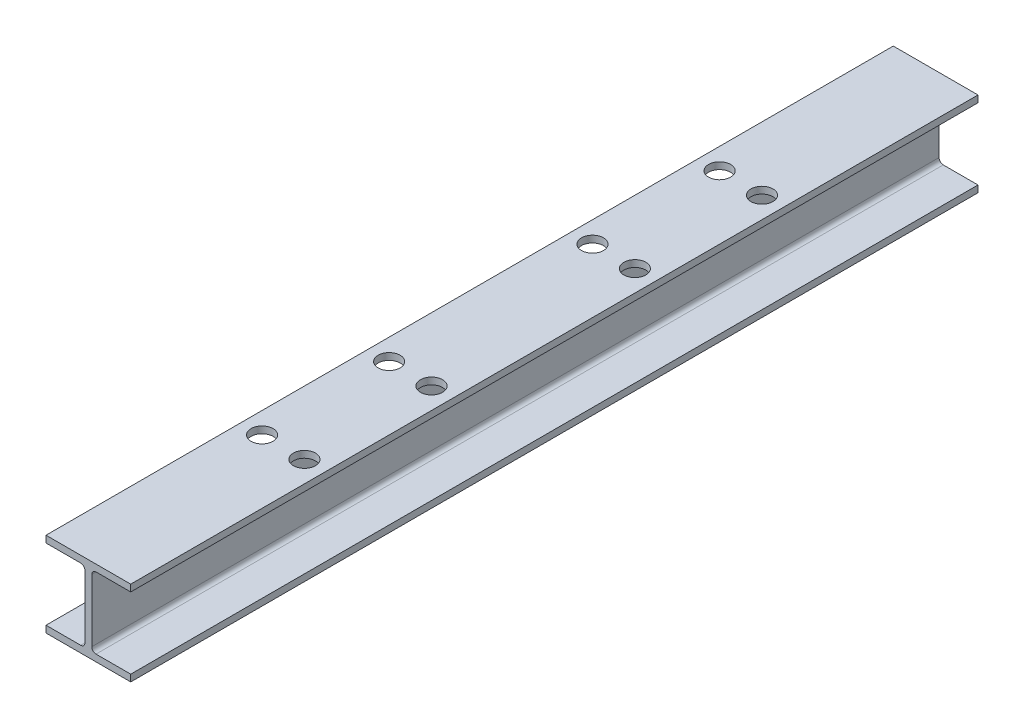
ISO-10303-21;
HEADER;
FILE_DESCRIPTION(('STEP AP214'),'2;1');
FILE_NAME('part.step','',(''),(''),'','','');
FILE_SCHEMA(('AUTOMOTIVE_DESIGN { 1 0 10303 214 1 1 1 1 }'));
ENDSEC;
DATA;
#1=APPLICATION_CONTEXT('core data for automotive mechanical design processes');
#2=APPLICATION_PROTOCOL_DEFINITION('international standard','automotive_design',2000,#1);
#3=PRODUCT_CONTEXT('',#1,'mechanical');
#4=PRODUCT('Part','Part','',(#3));
#5=PRODUCT_RELATED_PRODUCT_CATEGORY('part','',(#4));
#6=PRODUCT_DEFINITION_FORMATION('','',#4);
#7=PRODUCT_DEFINITION_CONTEXT('part definition',#1,'design');
#8=PRODUCT_DEFINITION('design','',#6,#7);
#9=PRODUCT_DEFINITION_SHAPE('','',#8);
#10=(LENGTH_UNIT() NAMED_UNIT(*) SI_UNIT(.MILLI.,.METRE.));
#11=(NAMED_UNIT(*) PLANE_ANGLE_UNIT() SI_UNIT($,.RADIAN.));
#12=(NAMED_UNIT(*) SI_UNIT($,.STERADIAN.) SOLID_ANGLE_UNIT());
#13=UNCERTAINTY_MEASURE_WITH_UNIT(LENGTH_MEASURE(1.E-05),#10,'distance_accuracy_value','');
#14=(GEOMETRIC_REPRESENTATION_CONTEXT(3) GLOBAL_UNCERTAINTY_ASSIGNED_CONTEXT((#13)) GLOBAL_UNIT_ASSIGNED_CONTEXT((#10,
#11,#12)) REPRESENTATION_CONTEXT('',''));
#15=CARTESIAN_POINT('',(0.,0.,0.));
#16=DIRECTION('',(0.,0.,1.));
#17=DIRECTION('',(1.,0.,0.));
#18=AXIS2_PLACEMENT_3D('',#15,#16,#17);
#19=CARTESIAN_POINT('',(25.,40.,380.));
#20=DIRECTION('',(0.,1.,0.));
#21=DIRECTION('',(0.,0.,1.));
#22=AXIS2_PLACEMENT_3D('',#19,#20,#21);
#23=CYLINDRICAL_SURFACE('',#22,13.);
#24=CARTESIAN_POINT('',(25.,50.,380.));
#25=DIRECTION('',(0.,1.,0.));
#26=DIRECTION('',(0.,0.,1.));
#27=AXIS2_PLACEMENT_3D('',#24,#25,#26);
#28=CIRCLE('',#27,13.);
#29=CARTESIAN_POINT('',(25.,50.,393.));
#30=VERTEX_POINT('',#29);
#31=EDGE_CURVE('E286',#30,#30,#28,.T.);
#32=ORIENTED_EDGE('',*,*,#31,.T.);
#33=EDGE_LOOP('',(#32));
#34=FACE_BOUND('',#33,.T.);
#35=CARTESIAN_POINT('',(25.,42.,380.));
#36=DIRECTION('',(0.,1.,0.));
#37=DIRECTION('',(0.,0.,1.));
#38=AXIS2_PLACEMENT_3D('',#35,#36,#37);
#39=CIRCLE('',#38,13.);
#40=CARTESIAN_POINT('',(25.,42.,393.));
#41=VERTEX_POINT('',#40);
#42=EDGE_CURVE('E44',#41,#41,#39,.T.);
#43=ORIENTED_EDGE('',*,*,#42,.F.);
#44=EDGE_LOOP('',(#43));
#45=FACE_BOUND('',#44,.T.);
#46=ADVANCED_FACE('F40',(#34,#45),#23,.F.);
#47=CARTESIAN_POINT('',(25.,40.,620.));
#48=DIRECTION('',(0.,1.,0.));
#49=DIRECTION('',(0.,0.,1.));
#50=AXIS2_PLACEMENT_3D('',#47,#48,#49);
#51=CYLINDRICAL_SURFACE('',#50,13.);
#52=CARTESIAN_POINT('',(25.,50.,620.));
#53=DIRECTION('',(0.,1.,0.));
#54=DIRECTION('',(0.,0.,1.));
#55=AXIS2_PLACEMENT_3D('',#52,#53,#54);
#56=CIRCLE('',#55,13.);
#57=CARTESIAN_POINT('',(25.,50.,633.));
#58=VERTEX_POINT('',#57);
#59=EDGE_CURVE('E288',#58,#58,#56,.T.);
#60=ORIENTED_EDGE('',*,*,#59,.T.);
#61=EDGE_LOOP('',(#60));
#62=FACE_BOUND('',#61,.T.);
#63=CARTESIAN_POINT('',(25.,42.,620.));
#64=DIRECTION('',(0.,1.,0.));
#65=DIRECTION('',(0.,0.,1.));
#66=AXIS2_PLACEMENT_3D('',#63,#64,#65);
#67=CIRCLE('',#66,13.);
#68=CARTESIAN_POINT('',(25.,42.,633.));
#69=VERTEX_POINT('',#68);
#70=EDGE_CURVE('E291',#69,#69,#67,.T.);
#71=ORIENTED_EDGE('',*,*,#70,.F.);
#72=EDGE_LOOP('',(#71));
#73=FACE_BOUND('',#72,.T.);
#74=ADVANCED_FACE('F333',(#62,#73),#51,.F.);
#75=CARTESIAN_POINT('',(25.,40.,230.));
#76=DIRECTION('',(0.,1.,0.));
#77=DIRECTION('',(0.,0.,1.));
#78=AXIS2_PLACEMENT_3D('',#75,#76,#77);
#79=CYLINDRICAL_SURFACE('',#78,13.);
#80=CARTESIAN_POINT('',(25.,50.,230.));
#81=DIRECTION('',(0.,1.,0.));
#82=DIRECTION('',(0.,0.,1.));
#83=AXIS2_PLACEMENT_3D('',#80,#81,#82);
#84=CIRCLE('',#83,13.);
#85=CARTESIAN_POINT('',(25.,50.,243.));
#86=VERTEX_POINT('',#85);
#87=EDGE_CURVE('E294',#86,#86,#84,.T.);
#88=ORIENTED_EDGE('',*,*,#87,.T.);
#89=EDGE_LOOP('',(#88));
#90=FACE_BOUND('',#89,.T.);
#91=CARTESIAN_POINT('',(25.,42.,230.));
#92=DIRECTION('',(0.,1.,0.));
#93=DIRECTION('',(0.,0.,1.));
#94=AXIS2_PLACEMENT_3D('',#91,#92,#93);
#95=CIRCLE('',#94,13.);
#96=CARTESIAN_POINT('',(25.,42.,243.));
#97=VERTEX_POINT('',#96);
#98=EDGE_CURVE('E311',#97,#97,#95,.T.);
#99=ORIENTED_EDGE('',*,*,#98,.F.);
#100=EDGE_LOOP('',(#99));
#101=FACE_BOUND('',#100,.T.);
#102=ADVANCED_FACE('F340',(#90,#101),#79,.F.);
#103=CARTESIAN_POINT('',(25.,40.,770.));
#104=DIRECTION('',(0.,1.,0.));
#105=DIRECTION('',(0.,0.,1.));
#106=AXIS2_PLACEMENT_3D('',#103,#104,#105);
#107=CYLINDRICAL_SURFACE('',#106,13.);
#108=CARTESIAN_POINT('',(25.,50.,770.));
#109=DIRECTION('',(0.,1.,0.));
#110=DIRECTION('',(0.,0.,1.));
#111=AXIS2_PLACEMENT_3D('',#108,#109,#110);
#112=CIRCLE('',#111,13.);
#113=CARTESIAN_POINT('',(25.,50.,783.));
#114=VERTEX_POINT('',#113);
#115=EDGE_CURVE('E297',#114,#114,#112,.T.);
#116=ORIENTED_EDGE('',*,*,#115,.T.);
#117=EDGE_LOOP('',(#116));
#118=FACE_BOUND('',#117,.T.);
#119=CARTESIAN_POINT('',(25.,42.,770.));
#120=DIRECTION('',(0.,1.,0.));
#121=DIRECTION('',(0.,0.,1.));
#122=AXIS2_PLACEMENT_3D('',#119,#120,#121);
#123=CIRCLE('',#122,13.);
#124=CARTESIAN_POINT('',(25.,42.,783.));
#125=VERTEX_POINT('',#124);
#126=EDGE_CURVE('E300',#125,#125,#123,.T.);
#127=ORIENTED_EDGE('',*,*,#126,.F.);
#128=EDGE_LOOP('',(#127));
#129=FACE_BOUND('',#128,.T.);
#130=ADVANCED_FACE('F547',(#118,#129),#107,.F.);
#131=CARTESIAN_POINT('',(50.,42.,1000.));
#132=DIRECTION('',(-1.,0.,0.));
#133=DIRECTION('',(0.,0.,1.));
#134=AXIS2_PLACEMENT_3D('',#131,#132,#133);
#135=PLANE('',#134);
#136=DIRECTION('',(0.,1.,0.));
#137=VECTOR('',#136,1.);
#138=CARTESIAN_POINT('',(50.,42.,0.));
#139=LINE('',#138,#137);
#140=CARTESIAN_POINT('',(50.,42.,0.));
#141=VERTEX_POINT('',#140);
#142=CARTESIAN_POINT('',(50.,50.,0.));
#143=VERTEX_POINT('',#142);
#144=EDGE_CURVE('E308',#141,#143,#139,.T.);
#145=ORIENTED_EDGE('',*,*,#144,.T.);
#146=DIRECTION('',(0.,0.,-1.));
#147=VECTOR('',#146,1.);
#148=CARTESIAN_POINT('',(50.,50.,1000.));
#149=LINE('',#148,#147);
#150=CARTESIAN_POINT('',(50.,50.,1000.));
#151=VERTEX_POINT('',#150);
#152=EDGE_CURVE('E315',#151,#143,#149,.T.);
#153=ORIENTED_EDGE('',*,*,#152,.F.);
#154=DIRECTION('',(0.,1.,0.));
#155=VECTOR('',#154,1.);
#156=CARTESIAN_POINT('',(50.,42.,1000.));
#157=LINE('',#156,#155);
#158=CARTESIAN_POINT('',(50.,42.,1000.));
#159=VERTEX_POINT('',#158);
#160=EDGE_CURVE('E301',#159,#151,#157,.T.);
#161=ORIENTED_EDGE('',*,*,#160,.F.);
#162=DIRECTION('',(0.,0.,-1.));
#163=VECTOR('',#162,1.);
#164=CARTESIAN_POINT('',(50.,42.,1000.));
#165=LINE('',#164,#163);
#166=EDGE_CURVE('E307',#159,#141,#165,.T.);
#167=ORIENTED_EDGE('',*,*,#166,.T.);
#168=EDGE_LOOP('',(#145,#153,#161,#167));
#169=FACE_BOUND('',#168,.T.);
#170=ADVANCED_FACE('F539',(#169),#135,.F.);
#171=CARTESIAN_POINT('',(4.,42.,1000.));
#172=DIRECTION('',(0.,1.,0.));
#173=DIRECTION('',(0.,0.,1.));
#174=AXIS2_PLACEMENT_3D('',#171,#172,#173);
#175=PLANE('',#174);
#176=ORIENTED_EDGE('',*,*,#42,.T.);
#177=EDGE_LOOP('',(#176));
#178=FACE_BOUND('',#177,.T.);
#179=ORIENTED_EDGE('',*,*,#70,.T.);
#180=EDGE_LOOP('',(#179));
#181=FACE_BOUND('',#180,.T.);
#182=ORIENTED_EDGE('',*,*,#98,.T.);
#183=EDGE_LOOP('',(#182));
#184=FACE_BOUND('',#183,.T.);
#185=ORIENTED_EDGE('',*,*,#126,.T.);
#186=EDGE_LOOP('',(#185));
#187=FACE_BOUND('',#186,.T.);
#188=DIRECTION('',(1.,0.,0.));
#189=VECTOR('',#188,1.);
#190=CARTESIAN_POINT('',(4.,42.,1000.));
#191=LINE('',#190,#189);
#192=CARTESIAN_POINT('',(9.,42.,1000.));
#193=VERTEX_POINT('',#192);
#194=EDGE_CURVE('E304',#193,#159,#191,.T.);
#195=ORIENTED_EDGE('',*,*,#194,.F.);
#196=DIRECTION('',(0.,0.,-1.));
#197=VECTOR('',#196,1.);
#198=CARTESIAN_POINT('',(9.,42.,0.));
#199=LINE('',#198,#197);
#200=CARTESIAN_POINT('',(9.,42.,0.));
#201=VERTEX_POINT('',#200);
#202=EDGE_CURVE('E318',#193,#201,#199,.T.);
#203=ORIENTED_EDGE('',*,*,#202,.T.);
#204=DIRECTION('',(1.,0.,0.));
#205=VECTOR('',#204,1.);
#206=CARTESIAN_POINT('',(4.,42.,0.));
#207=LINE('',#206,#205);
#208=EDGE_CURVE('E305',#201,#141,#207,.T.);
#209=ORIENTED_EDGE('',*,*,#208,.T.);
#210=ORIENTED_EDGE('',*,*,#166,.F.);
#211=EDGE_LOOP('',(#195,#203,#209,#210));
#212=FACE_BOUND('',#211,.T.);
#213=ADVANCED_FACE('F330',(#178,#181,#184,#187,#212),#175,.F.);
#214=CARTESIAN_POINT('',(0.,0.,0.));
#215=DIRECTION('',(0.,0.,-1.));
#216=DIRECTION('',(-1.,0.,0.));
#217=AXIS2_PLACEMENT_3D('',#214,#215,#216);
#218=PLANE('',#217);
#219=CARTESIAN_POINT('',(9.,37.,0.));
#220=DIRECTION('',(0.,0.,-1.));
#221=DIRECTION('',(-1.,0.,0.));
#222=AXIS2_PLACEMENT_3D('',#219,#220,#221);
#223=CIRCLE('',#222,5.);
#224=CARTESIAN_POINT('',(4.,37.,0.));
#225=VERTEX_POINT('',#224);
#226=EDGE_CURVE('E49',#201,#225,#223,.F.);
#227=ORIENTED_EDGE('',*,*,#226,.T.);
#228=DIRECTION('',(0.,1.,0.));
#229=VECTOR('',#228,1.);
#230=CARTESIAN_POINT('',(4.00000000000001,-42.,0.));
#231=LINE('',#230,#229);
#232=CARTESIAN_POINT('',(4.00000000000001,-37.,0.));
#233=VERTEX_POINT('',#232);
#234=EDGE_CURVE('E247',#233,#225,#231,.T.);
#235=ORIENTED_EDGE('',*,*,#234,.F.);
#236=CARTESIAN_POINT('',(9.00000000000001,-37.,0.));
#237=DIRECTION('',(0.,0.,-1.));
#238=DIRECTION('',(-1.,0.,0.));
#239=AXIS2_PLACEMENT_3D('',#236,#237,#238);
#240=CIRCLE('',#239,5.);
#241=CARTESIAN_POINT('',(9.00000000000001,-42.,0.));
#242=VERTEX_POINT('',#241);
#243=EDGE_CURVE('E276',#233,#242,#240,.F.);
#244=ORIENTED_EDGE('',*,*,#243,.T.);
#245=DIRECTION('',(-1.,0.,0.));
#246=VECTOR('',#245,1.);
#247=CARTESIAN_POINT('',(4.00000000000001,-42.,0.));
#248=LINE('',#247,#246);
#249=CARTESIAN_POINT('',(50.,-42.,0.));
#250=VERTEX_POINT('',#249);
#251=EDGE_CURVE('E260',#250,#242,#248,.T.);
#252=ORIENTED_EDGE('',*,*,#251,.F.);
#253=DIRECTION('',(0.,1.,0.));
#254=VECTOR('',#253,1.);
#255=CARTESIAN_POINT('',(50.,-50.,0.));
#256=LINE('',#255,#254);
#257=CARTESIAN_POINT('',(50.,-50.,0.));
#258=VERTEX_POINT('',#257);
#259=EDGE_CURVE('E264',#258,#250,#256,.T.);
#260=ORIENTED_EDGE('',*,*,#259,.F.);
#261=DIRECTION('',(1.,0.,0.));
#262=VECTOR('',#261,1.);
#263=CARTESIAN_POINT('',(-50.,-50.,0.));
#264=LINE('',#263,#262);
#265=CARTESIAN_POINT('',(-50.,-50.,0.));
#266=VERTEX_POINT('',#265);
#267=EDGE_CURVE('E256',#266,#258,#264,.T.);
#268=ORIENTED_EDGE('',*,*,#267,.F.);
#269=DIRECTION('',(0.,-1.,0.));
#270=VECTOR('',#269,1.);
#271=CARTESIAN_POINT('',(-50.,-50.,0.));
#272=LINE('',#271,#270);
#273=CARTESIAN_POINT('',(-50.,-42.,0.));
#274=VERTEX_POINT('',#273);
#275=EDGE_CURVE('E164',#274,#266,#272,.T.);
#276=ORIENTED_EDGE('',*,*,#275,.F.);
#277=DIRECTION('',(-1.,0.,0.));
#278=VECTOR('',#277,1.);
#279=CARTESIAN_POINT('',(-50.,-42.,0.));
#280=LINE('',#279,#278);
#281=CARTESIAN_POINT('',(-8.99999999999999,-42.,0.));
#282=VERTEX_POINT('',#281);
#283=EDGE_CURVE('E170',#282,#274,#280,.T.);
#284=ORIENTED_EDGE('',*,*,#283,.F.);
#285=CARTESIAN_POINT('',(-8.99999999999999,-37.,0.));
#286=DIRECTION('',(0.,0.,-1.));
#287=DIRECTION('',(-1.,0.,0.));
#288=AXIS2_PLACEMENT_3D('',#285,#286,#287);
#289=CIRCLE('',#288,5.);
#290=CARTESIAN_POINT('',(-3.99999999999999,-37.,0.));
#291=VERTEX_POINT('',#290);
#292=EDGE_CURVE('E185',#282,#291,#289,.F.);
#293=ORIENTED_EDGE('',*,*,#292,.T.);
#294=DIRECTION('',(0.,-1.,0.));
#295=VECTOR('',#294,1.);
#296=CARTESIAN_POINT('',(-3.99999999999999,-42.,0.));
#297=LINE('',#296,#295);
#298=CARTESIAN_POINT('',(-4.,37.,0.));
#299=VERTEX_POINT('',#298);
#300=EDGE_CURVE('E228',#299,#291,#297,.T.);
#301=ORIENTED_EDGE('',*,*,#300,.F.);
#302=CARTESIAN_POINT('',(-9.,37.,0.));
#303=DIRECTION('',(0.,0.,-1.));
#304=DIRECTION('',(-1.,0.,0.));
#305=AXIS2_PLACEMENT_3D('',#302,#303,#304);
#306=CIRCLE('',#305,5.);
#307=CARTESIAN_POINT('',(-9.,42.,0.));
#308=VERTEX_POINT('',#307);
#309=EDGE_CURVE('E223',#299,#308,#306,.F.);
#310=ORIENTED_EDGE('',*,*,#309,.T.);
#311=DIRECTION('',(1.,0.,0.));
#312=VECTOR('',#311,1.);
#313=CARTESIAN_POINT('',(-50.,42.,0.));
#314=LINE('',#313,#312);
#315=CARTESIAN_POINT('',(-50.,42.,0.));
#316=VERTEX_POINT('',#315);
#317=EDGE_CURVE('E207',#316,#308,#314,.T.);
#318=ORIENTED_EDGE('',*,*,#317,.F.);
#319=DIRECTION('',(0.,-1.,0.));
#320=VECTOR('',#319,1.);
#321=CARTESIAN_POINT('',(-50.,42.,0.));
#322=LINE('',#321,#320);
#323=CARTESIAN_POINT('',(-50.,50.,0.));
#324=VERTEX_POINT('',#323);
#325=EDGE_CURVE('E211',#324,#316,#322,.T.);
#326=ORIENTED_EDGE('',*,*,#325,.F.);
#327=DIRECTION('',(-1.,0.,0.));
#328=VECTOR('',#327,1.);
#329=CARTESIAN_POINT('',(-50.,50.,0.));
#330=LINE('',#329,#328);
#331=EDGE_CURVE('E281',#143,#324,#330,.T.);
#332=ORIENTED_EDGE('',*,*,#331,.F.);
#333=ORIENTED_EDGE('',*,*,#144,.F.);
#334=ORIENTED_EDGE('',*,*,#208,.F.);
#335=EDGE_LOOP('',(#227,#235,#244,#252,#260,#268,#276,#284,#293,#301,#310,#318,#326,#332,#333,#334));
#336=FACE_BOUND('',#335,.T.);
#337=ADVANCED_FACE('F525',(#336),#218,.T.);
#338=CARTESIAN_POINT('',(0.,0.,1000.));
#339=DIRECTION('',(0.,0.,-1.));
#340=DIRECTION('',(-1.,0.,0.));
#341=AXIS2_PLACEMENT_3D('',#338,#339,#340);
#342=PLANE('',#341);
#343=DIRECTION('',(-1.,0.,0.));
#344=VECTOR('',#343,1.);
#345=CARTESIAN_POINT('',(-50.,50.,1000.));
#346=LINE('',#345,#344);
#347=CARTESIAN_POINT('',(-50.,50.,1000.));
#348=VERTEX_POINT('',#347);
#349=EDGE_CURVE('E284',#151,#348,#346,.T.);
#350=ORIENTED_EDGE('',*,*,#349,.T.);
#351=DIRECTION('',(0.,-1.,0.));
#352=VECTOR('',#351,1.);
#353=CARTESIAN_POINT('',(-50.,42.,1000.));
#354=LINE('',#353,#352);
#355=CARTESIAN_POINT('',(-50.,42.,1000.));
#356=VERTEX_POINT('',#355);
#357=EDGE_CURVE('E204',#348,#356,#354,.T.);
#358=ORIENTED_EDGE('',*,*,#357,.T.);
#359=DIRECTION('',(1.,0.,0.));
#360=VECTOR('',#359,1.);
#361=CARTESIAN_POINT('',(-50.,42.,1000.));
#362=LINE('',#361,#360);
#363=CARTESIAN_POINT('',(-9.,42.,1000.));
#364=VERTEX_POINT('',#363);
#365=EDGE_CURVE('E206',#356,#364,#362,.T.);
#366=ORIENTED_EDGE('',*,*,#365,.T.);
#367=CARTESIAN_POINT('',(-9.,37.,1000.));
#368=DIRECTION('',(0.,0.,-1.));
#369=DIRECTION('',(-1.,0.,0.));
#370=AXIS2_PLACEMENT_3D('',#367,#368,#369);
#371=CIRCLE('',#370,5.);
#372=CARTESIAN_POINT('',(-4.,37.,1000.));
#373=VERTEX_POINT('',#372);
#374=EDGE_CURVE('E225',#364,#373,#371,.T.);
#375=ORIENTED_EDGE('',*,*,#374,.T.);
#376=DIRECTION('',(0.,-1.,0.));
#377=VECTOR('',#376,1.);
#378=CARTESIAN_POINT('',(-3.99999999999999,-42.,1000.));
#379=LINE('',#378,#377);
#380=CARTESIAN_POINT('',(-3.99999999999999,-37.,1000.));
#381=VERTEX_POINT('',#380);
#382=EDGE_CURVE('E245',#373,#381,#379,.T.);
#383=ORIENTED_EDGE('',*,*,#382,.T.);
#384=CARTESIAN_POINT('',(-8.99999999999999,-37.,1000.));
#385=DIRECTION('',(0.,0.,-1.));
#386=DIRECTION('',(-1.,0.,0.));
#387=AXIS2_PLACEMENT_3D('',#384,#385,#386);
#388=CIRCLE('',#387,5.);
#389=CARTESIAN_POINT('',(-8.99999999999999,-42.,1000.));
#390=VERTEX_POINT('',#389);
#391=EDGE_CURVE('E160',#381,#390,#388,.T.);
#392=ORIENTED_EDGE('',*,*,#391,.T.);
#393=DIRECTION('',(-1.,0.,0.));
#394=VECTOR('',#393,1.);
#395=CARTESIAN_POINT('',(-50.,-42.,1000.));
#396=LINE('',#395,#394);
#397=CARTESIAN_POINT('',(-50.,-42.,1000.));
#398=VERTEX_POINT('',#397);
#399=EDGE_CURVE('E154',#390,#398,#396,.T.);
#400=ORIENTED_EDGE('',*,*,#399,.T.);
#401=DIRECTION('',(0.,-1.,0.));
#402=VECTOR('',#401,1.);
#403=CARTESIAN_POINT('',(-50.,-50.,1000.));
#404=LINE('',#403,#402);
#405=CARTESIAN_POINT('',(-50.,-50.,1000.));
#406=VERTEX_POINT('',#405);
#407=EDGE_CURVE('E157',#398,#406,#404,.T.);
#408=ORIENTED_EDGE('',*,*,#407,.T.);
#409=DIRECTION('',(1.,0.,0.));
#410=VECTOR('',#409,1.);
#411=CARTESIAN_POINT('',(-50.,-50.,1000.));
#412=LINE('',#411,#410);
#413=CARTESIAN_POINT('',(50.,-50.,1000.));
#414=VERTEX_POINT('',#413);
#415=EDGE_CURVE('E266',#406,#414,#412,.T.);
#416=ORIENTED_EDGE('',*,*,#415,.T.);
#417=DIRECTION('',(0.,1.,0.));
#418=VECTOR('',#417,1.);
#419=CARTESIAN_POINT('',(50.,-50.,1000.));
#420=LINE('',#419,#418);
#421=CARTESIAN_POINT('',(50.,-42.,1000.));
#422=VERTEX_POINT('',#421);
#423=EDGE_CURVE('E257',#414,#422,#420,.T.);
#424=ORIENTED_EDGE('',*,*,#423,.T.);
#425=DIRECTION('',(-1.,0.,0.));
#426=VECTOR('',#425,1.);
#427=CARTESIAN_POINT('',(4.00000000000001,-42.,1000.));
#428=LINE('',#427,#426);
#429=CARTESIAN_POINT('',(9.00000000000001,-42.,1000.));
#430=VERTEX_POINT('',#429);
#431=EDGE_CURVE('E259',#422,#430,#428,.T.);
#432=ORIENTED_EDGE('',*,*,#431,.T.);
#433=CARTESIAN_POINT('',(9.00000000000001,-37.,1000.));
#434=DIRECTION('',(0.,0.,-1.));
#435=DIRECTION('',(-1.,0.,0.));
#436=AXIS2_PLACEMENT_3D('',#433,#434,#435);
#437=CIRCLE('',#436,5.);
#438=CARTESIAN_POINT('',(4.00000000000001,-37.,1000.));
#439=VERTEX_POINT('',#438);
#440=EDGE_CURVE('E278',#430,#439,#437,.T.);
#441=ORIENTED_EDGE('',*,*,#440,.T.);
#442=DIRECTION('',(0.,1.,0.));
#443=VECTOR('',#442,1.);
#444=CARTESIAN_POINT('',(4.00000000000001,-42.,1000.));
#445=LINE('',#444,#443);
#446=CARTESIAN_POINT('',(4.,37.,1000.));
#447=VERTEX_POINT('',#446);
#448=EDGE_CURVE('E244',#439,#447,#445,.T.);
#449=ORIENTED_EDGE('',*,*,#448,.T.);
#450=CARTESIAN_POINT('',(9.,37.,1000.));
#451=DIRECTION('',(0.,0.,-1.));
#452=DIRECTION('',(-1.,0.,0.));
#453=AXIS2_PLACEMENT_3D('',#450,#451,#452);
#454=CIRCLE('',#453,5.);
#455=EDGE_CURVE('E11',#447,#193,#454,.T.);
#456=ORIENTED_EDGE('',*,*,#455,.T.);
#457=ORIENTED_EDGE('',*,*,#194,.T.);
#458=ORIENTED_EDGE('',*,*,#160,.T.);
#459=EDGE_LOOP('',(#350,#358,#366,#375,#383,#392,#400,#408,#416,#424,#432,#441,#449,#456,#457,#458));
#460=FACE_BOUND('',#459,.T.);
#461=ADVANCED_FACE('F42',(#460),#342,.F.);
#462=CARTESIAN_POINT('',(9.,37.,1000.));
#463=DIRECTION('',(0.,0.,1.));
#464=DIRECTION('',(1.,0.,0.));
#465=AXIS2_PLACEMENT_3D('',#462,#463,#464);
#466=CYLINDRICAL_SURFACE('',#465,5.);
#467=ORIENTED_EDGE('',*,*,#455,.F.);
#468=DIRECTION('',(0.,0.,-1.));
#469=VECTOR('',#468,1.);
#470=CARTESIAN_POINT('',(4.,37.,1000.));
#471=LINE('',#470,#469);
#472=EDGE_CURVE('E240',#225,#447,#471,.F.);
#473=ORIENTED_EDGE('',*,*,#472,.F.);
#474=ORIENTED_EDGE('',*,*,#226,.F.);
#475=ORIENTED_EDGE('',*,*,#202,.F.);
#476=EDGE_LOOP('',(#467,#473,#474,#475));
#477=FACE_BOUND('',#476,.T.);
#478=ADVANCED_FACE('F352',(#477),#466,.F.);
#479=CARTESIAN_POINT('',(-50.,50.,1000.));
#480=DIRECTION('',(0.,-1.,0.));
#481=DIRECTION('',(0.,0.,-1.));
#482=AXIS2_PLACEMENT_3D('',#479,#480,#481);
#483=PLANE('',#482);
#484=ORIENTED_EDGE('',*,*,#331,.T.);
#485=DIRECTION('',(0.,0.,-1.));
#486=VECTOR('',#485,1.);
#487=CARTESIAN_POINT('',(-50.,50.,1000.));
#488=LINE('',#487,#486);
#489=EDGE_CURVE('E218',#348,#324,#488,.T.);
#490=ORIENTED_EDGE('',*,*,#489,.F.);
#491=ORIENTED_EDGE('',*,*,#349,.F.);
#492=ORIENTED_EDGE('',*,*,#152,.T.);
#493=EDGE_LOOP('',(#484,#490,#491,#492));
#494=FACE_BOUND('',#493,.T.);
#495=ORIENTED_EDGE('',*,*,#115,.F.);
#496=EDGE_LOOP('',(#495));
#497=FACE_BOUND('',#496,.T.);
#498=ORIENTED_EDGE('',*,*,#87,.F.);
#499=EDGE_LOOP('',(#498));
#500=FACE_BOUND('',#499,.T.);
#501=ORIENTED_EDGE('',*,*,#59,.F.);
#502=EDGE_LOOP('',(#501));
#503=FACE_BOUND('',#502,.T.);
#504=ORIENTED_EDGE('',*,*,#31,.F.);
#505=EDGE_LOOP('',(#504));
#506=FACE_BOUND('',#505,.T.);
#507=CARTESIAN_POINT('',(-25.,50.,230.));
#508=DIRECTION('',(0.,1.,0.));
#509=DIRECTION('',(0.,0.,1.));
#510=AXIS2_PLACEMENT_3D('',#507,#508,#509);
#511=CIRCLE('',#510,13.);
#512=CARTESIAN_POINT('',(-25.,50.,243.));
#513=VERTEX_POINT('',#512);
#514=EDGE_CURVE('E196',#513,#513,#511,.T.);
#515=ORIENTED_EDGE('',*,*,#514,.F.);
#516=EDGE_LOOP('',(#515));
#517=FACE_BOUND('',#516,.T.);
#518=CARTESIAN_POINT('',(-25.,50.,770.));
#519=DIRECTION('',(0.,1.,0.));
#520=DIRECTION('',(0.,0.,1.));
#521=AXIS2_PLACEMENT_3D('',#518,#519,#520);
#522=CIRCLE('',#521,13.);
#523=CARTESIAN_POINT('',(-25.,50.,783.));
#524=VERTEX_POINT('',#523);
#525=EDGE_CURVE('E199',#524,#524,#522,.T.);
#526=ORIENTED_EDGE('',*,*,#525,.F.);
#527=EDGE_LOOP('',(#526));
#528=FACE_BOUND('',#527,.T.);
#529=CARTESIAN_POINT('',(-25.,50.,620.));
#530=DIRECTION('',(0.,1.,0.));
#531=DIRECTION('',(0.,0.,1.));
#532=AXIS2_PLACEMENT_3D('',#529,#530,#531);
#533=CIRCLE('',#532,13.);
#534=CARTESIAN_POINT('',(-25.,50.,633.));
#535=VERTEX_POINT('',#534);
#536=EDGE_CURVE('E192',#535,#535,#533,.T.);
#537=ORIENTED_EDGE('',*,*,#536,.F.);
#538=EDGE_LOOP('',(#537));
#539=FACE_BOUND('',#538,.T.);
#540=CARTESIAN_POINT('',(-25.,50.,380.));
#541=DIRECTION('',(0.,1.,0.));
#542=DIRECTION('',(0.,0.,1.));
#543=AXIS2_PLACEMENT_3D('',#540,#541,#542);
#544=CIRCLE('',#543,13.);
#545=CARTESIAN_POINT('',(-25.,50.,393.));
#546=VERTEX_POINT('',#545);
#547=EDGE_CURVE('E189',#546,#546,#544,.T.);
#548=ORIENTED_EDGE('',*,*,#547,.F.);
#549=EDGE_LOOP('',(#548));
#550=FACE_BOUND('',#549,.T.);
#551=ADVANCED_FACE('F349',(#494,#497,#500,#503,#506,#517,#528,#539,#550),#483,.F.);
#552=CARTESIAN_POINT('',(50.,-50.,1000.));
#553=DIRECTION('',(-1.,0.,0.));
#554=DIRECTION('',(0.,0.,1.));
#555=AXIS2_PLACEMENT_3D('',#552,#553,#554);
#556=PLANE('',#555);
#557=ORIENTED_EDGE('',*,*,#259,.T.);
#558=DIRECTION('',(0.,0.,-1.));
#559=VECTOR('',#558,1.);
#560=CARTESIAN_POINT('',(50.,-42.,1000.));
#561=LINE('',#560,#559);
#562=EDGE_CURVE('E263',#422,#250,#561,.T.);
#563=ORIENTED_EDGE('',*,*,#562,.F.);
#564=ORIENTED_EDGE('',*,*,#423,.F.);
#565=DIRECTION('',(0.,0.,-1.));
#566=VECTOR('',#565,1.);
#567=CARTESIAN_POINT('',(50.,-50.,1000.));
#568=LINE('',#567,#566);
#569=EDGE_CURVE('E271',#414,#258,#568,.T.);
#570=ORIENTED_EDGE('',*,*,#569,.T.);
#571=EDGE_LOOP('',(#557,#563,#564,#570));
#572=FACE_BOUND('',#571,.T.);
#573=ADVANCED_FACE('F351',(#572),#556,.F.);
#574=CARTESIAN_POINT('',(-50.,-50.,1000.));
#575=DIRECTION('',(0.,1.,0.));
#576=DIRECTION('',(0.,0.,1.));
#577=AXIS2_PLACEMENT_3D('',#574,#575,#576);
#578=PLANE('',#577);
#579=ORIENTED_EDGE('',*,*,#415,.F.);
#580=DIRECTION('',(0.,0.,-1.));
#581=VECTOR('',#580,1.);
#582=CARTESIAN_POINT('',(-50.,-50.,1000.));
#583=LINE('',#582,#581);
#584=EDGE_CURVE('E175',#406,#266,#583,.T.);
#585=ORIENTED_EDGE('',*,*,#584,.T.);
#586=ORIENTED_EDGE('',*,*,#267,.T.);
#587=ORIENTED_EDGE('',*,*,#569,.F.);
#588=EDGE_LOOP('',(#579,#585,#586,#587));
#589=FACE_BOUND('',#588,.T.);
#590=ADVANCED_FACE('F359',(#589),#578,.F.);
#591=CARTESIAN_POINT('',(4.00000000000001,-42.,1000.));
#592=DIRECTION('',(0.,-1.,0.));
#593=DIRECTION('',(0.,0.,-1.));
#594=AXIS2_PLACEMENT_3D('',#591,#592,#593);
#595=PLANE('',#594);
#596=ORIENTED_EDGE('',*,*,#251,.T.);
#597=DIRECTION('',(0.,0.,-1.));
#598=VECTOR('',#597,1.);
#599=CARTESIAN_POINT('',(9.00000000000001,-42.,1000.));
#600=LINE('',#599,#598);
#601=EDGE_CURVE('E274',#242,#430,#600,.F.);
#602=ORIENTED_EDGE('',*,*,#601,.T.);
#603=ORIENTED_EDGE('',*,*,#431,.F.);
#604=ORIENTED_EDGE('',*,*,#562,.T.);
#605=EDGE_LOOP('',(#596,#602,#603,#604));
#606=FACE_BOUND('',#605,.T.);
#607=ADVANCED_FACE('F346',(#606),#595,.F.);
#608=CARTESIAN_POINT('',(9.00000000000001,-37.,1000.));
#609=DIRECTION('',(0.,0.,1.));
#610=DIRECTION('',(1.,0.,0.));
#611=AXIS2_PLACEMENT_3D('',#608,#609,#610);
#612=CYLINDRICAL_SURFACE('',#611,5.);
#613=ORIENTED_EDGE('',*,*,#440,.F.);
#614=ORIENTED_EDGE('',*,*,#601,.F.);
#615=ORIENTED_EDGE('',*,*,#243,.F.);
#616=DIRECTION('',(0.,0.,-1.));
#617=VECTOR('',#616,1.);
#618=CARTESIAN_POINT('',(4.00000000000001,-37.,0.));
#619=LINE('',#618,#617);
#620=EDGE_CURVE('E253',#439,#233,#619,.T.);
#621=ORIENTED_EDGE('',*,*,#620,.F.);
#622=EDGE_LOOP('',(#613,#614,#615,#621));
#623=FACE_BOUND('',#622,.T.);
#624=ADVANCED_FACE('F336',(#623),#612,.F.);
#625=CARTESIAN_POINT('',(4.00000000000001,-37.,1000.));
#626=DIRECTION('',(1.,0.,0.));
#627=DIRECTION('',(0.,1.,0.));
#628=AXIS2_PLACEMENT_3D('',#625,#626,#627);
#629=PLANE('',#628);
#630=ORIENTED_EDGE('',*,*,#448,.F.);
#631=ORIENTED_EDGE('',*,*,#620,.T.);
#632=ORIENTED_EDGE('',*,*,#234,.T.);
#633=ORIENTED_EDGE('',*,*,#472,.T.);
#634=EDGE_LOOP('',(#630,#631,#632,#633));
#635=FACE_BOUND('',#634,.T.);
#636=ADVANCED_FACE('F345',(#635),#629,.T.);
#637=CARTESIAN_POINT('',(-50.,-50.,1000.));
#638=DIRECTION('',(1.,0.,0.));
#639=DIRECTION('',(0.,0.,-1.));
#640=AXIS2_PLACEMENT_3D('',#637,#638,#639);
#641=PLANE('',#640);
#642=ORIENTED_EDGE('',*,*,#275,.T.);
#643=ORIENTED_EDGE('',*,*,#584,.F.);
#644=ORIENTED_EDGE('',*,*,#407,.F.);
#645=DIRECTION('',(0.,0.,-1.));
#646=VECTOR('',#645,1.);
#647=CARTESIAN_POINT('',(-50.,-42.,1000.));
#648=LINE('',#647,#646);
#649=EDGE_CURVE('E167',#398,#274,#648,.T.);
#650=ORIENTED_EDGE('',*,*,#649,.T.);
#651=EDGE_LOOP('',(#642,#643,#644,#650));
#652=FACE_BOUND('',#651,.T.);
#653=ADVANCED_FACE('F177',(#652),#641,.F.);
#654=CARTESIAN_POINT('',(-50.,-42.,1000.));
#655=DIRECTION('',(0.,-1.,0.));
#656=DIRECTION('',(0.,0.,-1.));
#657=AXIS2_PLACEMENT_3D('',#654,#655,#656);
#658=PLANE('',#657);
#659=ORIENTED_EDGE('',*,*,#399,.F.);
#660=DIRECTION('',(0.,0.,-1.));
#661=VECTOR('',#660,1.);
#662=CARTESIAN_POINT('',(-8.99999999999999,-42.,0.));
#663=LINE('',#662,#661);
#664=EDGE_CURVE('E174',#390,#282,#663,.T.);
#665=ORIENTED_EDGE('',*,*,#664,.T.);
#666=ORIENTED_EDGE('',*,*,#283,.T.);
#667=ORIENTED_EDGE('',*,*,#649,.F.);
#668=EDGE_LOOP('',(#659,#665,#666,#667));
#669=FACE_BOUND('',#668,.T.);
#670=ADVANCED_FACE('F168',(#669),#658,.F.);
#671=CARTESIAN_POINT('',(-8.99999999999999,-37.,1000.));
#672=DIRECTION('',(0.,0.,1.));
#673=DIRECTION('',(1.,0.,0.));
#674=AXIS2_PLACEMENT_3D('',#671,#672,#673);
#675=CYLINDRICAL_SURFACE('',#674,5.);
#676=ORIENTED_EDGE('',*,*,#391,.F.);
#677=DIRECTION('',(0.,0.,-1.));
#678=VECTOR('',#677,1.);
#679=CARTESIAN_POINT('',(-3.99999999999999,-37.,1000.));
#680=LINE('',#679,#678);
#681=EDGE_CURVE('E241',#291,#381,#680,.F.);
#682=ORIENTED_EDGE('',*,*,#681,.F.);
#683=ORIENTED_EDGE('',*,*,#292,.F.);
#684=ORIENTED_EDGE('',*,*,#664,.F.);
#685=EDGE_LOOP('',(#676,#682,#683,#684));
#686=FACE_BOUND('',#685,.T.);
#687=ADVANCED_FACE('F362',(#686),#675,.F.);
#688=CARTESIAN_POINT('',(-25.,40.,230.));
#689=DIRECTION('',(0.,1.,0.));
#690=DIRECTION('',(0.,0.,1.));
#691=AXIS2_PLACEMENT_3D('',#688,#689,#690);
#692=CYLINDRICAL_SURFACE('',#691,13.);
#693=ORIENTED_EDGE('',*,*,#514,.T.);
#694=EDGE_LOOP('',(#693));
#695=FACE_BOUND('',#694,.T.);
#696=CARTESIAN_POINT('',(-25.,42.,230.));
#697=DIRECTION('',(0.,1.,0.));
#698=DIRECTION('',(0.,0.,1.));
#699=AXIS2_PLACEMENT_3D('',#696,#697,#698);
#700=CIRCLE('',#699,13.);
#701=CARTESIAN_POINT('',(-25.,42.,243.));
#702=VERTEX_POINT('',#701);
#703=EDGE_CURVE('E203',#702,#702,#700,.T.);
#704=ORIENTED_EDGE('',*,*,#703,.F.);
#705=EDGE_LOOP('',(#704));
#706=FACE_BOUND('',#705,.T.);
#707=ADVANCED_FACE('F380',(#695,#706),#692,.F.);
#708=CARTESIAN_POINT('',(-25.,40.,770.));
#709=DIRECTION('',(0.,1.,0.));
#710=DIRECTION('',(0.,0.,1.));
#711=AXIS2_PLACEMENT_3D('',#708,#709,#710);
#712=CYLINDRICAL_SURFACE('',#711,13.);
#713=ORIENTED_EDGE('',*,*,#525,.T.);
#714=EDGE_LOOP('',(#713));
#715=FACE_BOUND('',#714,.T.);
#716=CARTESIAN_POINT('',(-25.,42.,770.));
#717=DIRECTION('',(0.,1.,0.));
#718=DIRECTION('',(0.,0.,1.));
#719=AXIS2_PLACEMENT_3D('',#716,#717,#718);
#720=CIRCLE('',#719,13.);
#721=CARTESIAN_POINT('',(-25.,42.,783.));
#722=VERTEX_POINT('',#721);
#723=EDGE_CURVE('E213',#722,#722,#720,.T.);
#724=ORIENTED_EDGE('',*,*,#723,.F.);
#725=EDGE_LOOP('',(#724));
#726=FACE_BOUND('',#725,.T.);
#727=ADVANCED_FACE('F393',(#715,#726),#712,.F.);
#728=CARTESIAN_POINT('',(-25.,40.,620.));
#729=DIRECTION('',(0.,1.,0.));
#730=DIRECTION('',(0.,0.,1.));
#731=AXIS2_PLACEMENT_3D('',#728,#729,#730);
#732=CYLINDRICAL_SURFACE('',#731,13.);
#733=ORIENTED_EDGE('',*,*,#536,.T.);
#734=EDGE_LOOP('',(#733));
#735=FACE_BOUND('',#734,.T.);
#736=CARTESIAN_POINT('',(-25.,42.,620.));
#737=DIRECTION('',(0.,1.,0.));
#738=DIRECTION('',(0.,0.,1.));
#739=AXIS2_PLACEMENT_3D('',#736,#737,#738);
#740=CIRCLE('',#739,13.);
#741=CARTESIAN_POINT('',(-25.,42.,633.));
#742=VERTEX_POINT('',#741);
#743=EDGE_CURVE('E195',#742,#742,#740,.T.);
#744=ORIENTED_EDGE('',*,*,#743,.F.);
#745=EDGE_LOOP('',(#744));
#746=FACE_BOUND('',#745,.T.);
#747=ADVANCED_FACE('F396',(#735,#746),#732,.F.);
#748=CARTESIAN_POINT('',(-25.,40.,380.));
#749=DIRECTION('',(0.,1.,0.));
#750=DIRECTION('',(0.,0.,1.));
#751=AXIS2_PLACEMENT_3D('',#748,#749,#750);
#752=CYLINDRICAL_SURFACE('',#751,13.);
#753=ORIENTED_EDGE('',*,*,#547,.T.);
#754=EDGE_LOOP('',(#753));
#755=FACE_BOUND('',#754,.T.);
#756=CARTESIAN_POINT('',(-25.,42.,380.));
#757=DIRECTION('',(0.,1.,0.));
#758=DIRECTION('',(0.,0.,1.));
#759=AXIS2_PLACEMENT_3D('',#756,#757,#758);
#760=CIRCLE('',#759,13.);
#761=CARTESIAN_POINT('',(-25.,42.,393.));
#762=VERTEX_POINT('',#761);
#763=EDGE_CURVE('E200',#762,#762,#760,.T.);
#764=ORIENTED_EDGE('',*,*,#763,.F.);
#765=EDGE_LOOP('',(#764));
#766=FACE_BOUND('',#765,.T.);
#767=ADVANCED_FACE('F388',(#755,#766),#752,.F.);
#768=CARTESIAN_POINT('',(-50.,42.,1000.));
#769=DIRECTION('',(1.,0.,0.));
#770=DIRECTION('',(0.,0.,-1.));
#771=AXIS2_PLACEMENT_3D('',#768,#769,#770);
#772=PLANE('',#771);
#773=ORIENTED_EDGE('',*,*,#325,.T.);
#774=DIRECTION('',(0.,0.,-1.));
#775=VECTOR('',#774,1.);
#776=CARTESIAN_POINT('',(-50.,42.,1000.));
#777=LINE('',#776,#775);
#778=EDGE_CURVE('E210',#356,#316,#777,.T.);
#779=ORIENTED_EDGE('',*,*,#778,.F.);
#780=ORIENTED_EDGE('',*,*,#357,.F.);
#781=ORIENTED_EDGE('',*,*,#489,.T.);
#782=EDGE_LOOP('',(#773,#779,#780,#781));
#783=FACE_BOUND('',#782,.T.);
#784=ADVANCED_FACE('F385',(#783),#772,.F.);
#785=CARTESIAN_POINT('',(-50.,42.,1000.));
#786=DIRECTION('',(0.,1.,0.));
#787=DIRECTION('',(0.,0.,1.));
#788=AXIS2_PLACEMENT_3D('',#785,#786,#787);
#789=PLANE('',#788);
#790=ORIENTED_EDGE('',*,*,#763,.T.);
#791=EDGE_LOOP('',(#790));
#792=FACE_BOUND('',#791,.T.);
#793=ORIENTED_EDGE('',*,*,#743,.T.);
#794=EDGE_LOOP('',(#793));
#795=FACE_BOUND('',#794,.T.);
#796=ORIENTED_EDGE('',*,*,#723,.T.);
#797=EDGE_LOOP('',(#796));
#798=FACE_BOUND('',#797,.T.);
#799=ORIENTED_EDGE('',*,*,#703,.T.);
#800=EDGE_LOOP('',(#799));
#801=FACE_BOUND('',#800,.T.);
#802=ORIENTED_EDGE('',*,*,#317,.T.);
#803=DIRECTION('',(0.,0.,-1.));
#804=VECTOR('',#803,1.);
#805=CARTESIAN_POINT('',(-9.,42.,1000.));
#806=LINE('',#805,#804);
#807=EDGE_CURVE('E221',#308,#364,#806,.F.);
#808=ORIENTED_EDGE('',*,*,#807,.T.);
#809=ORIENTED_EDGE('',*,*,#365,.F.);
#810=ORIENTED_EDGE('',*,*,#778,.T.);
#811=EDGE_LOOP('',(#802,#808,#809,#810));
#812=FACE_BOUND('',#811,.T.);
#813=ADVANCED_FACE('F383',(#792,#795,#798,#801,#812),#789,.F.);
#814=CARTESIAN_POINT('',(-9.,37.,1000.));
#815=DIRECTION('',(0.,0.,1.));
#816=DIRECTION('',(1.,0.,0.));
#817=AXIS2_PLACEMENT_3D('',#814,#815,#816);
#818=CYLINDRICAL_SURFACE('',#817,5.);
#819=ORIENTED_EDGE('',*,*,#374,.F.);
#820=ORIENTED_EDGE('',*,*,#807,.F.);
#821=ORIENTED_EDGE('',*,*,#309,.F.);
#822=DIRECTION('',(0.,0.,-1.));
#823=VECTOR('',#822,1.);
#824=CARTESIAN_POINT('',(-4.,37.,0.));
#825=LINE('',#824,#823);
#826=EDGE_CURVE('E237',#373,#299,#825,.T.);
#827=ORIENTED_EDGE('',*,*,#826,.F.);
#828=EDGE_LOOP('',(#819,#820,#821,#827));
#829=FACE_BOUND('',#828,.T.);
#830=ADVANCED_FACE('F378',(#829),#818,.F.);
#831=CARTESIAN_POINT('',(-4.,37.,1000.));
#832=DIRECTION('',(-1.,0.,0.));
#833=DIRECTION('',(0.,-1.,0.));
#834=AXIS2_PLACEMENT_3D('',#831,#832,#833);
#835=PLANE('',#834);
#836=ORIENTED_EDGE('',*,*,#382,.F.);
#837=ORIENTED_EDGE('',*,*,#826,.T.);
#838=ORIENTED_EDGE('',*,*,#300,.T.);
#839=ORIENTED_EDGE('',*,*,#681,.T.);
#840=EDGE_LOOP('',(#836,#837,#838,#839));
#841=FACE_BOUND('',#840,.T.);
#842=ADVANCED_FACE('F375',(#841),#835,.T.);
#843=CLOSED_SHELL('',(#46,#74,#102,#130,#170,#213,#337,#461,#478,#551,#573,#590,#607,#624,#636,
#653,#670,#687,#707,#727,#747,#767,#784,#813,#830,#842));
#844=MANIFOLD_SOLID_BREP('B2',#843);
#845=ADVANCED_BREP_SHAPE_REPRESENTATION('',(#18,#844),#14);
#846=SHAPE_DEFINITION_REPRESENTATION(#9,#845);
ENDSEC;
END-ISO-10303-21;
